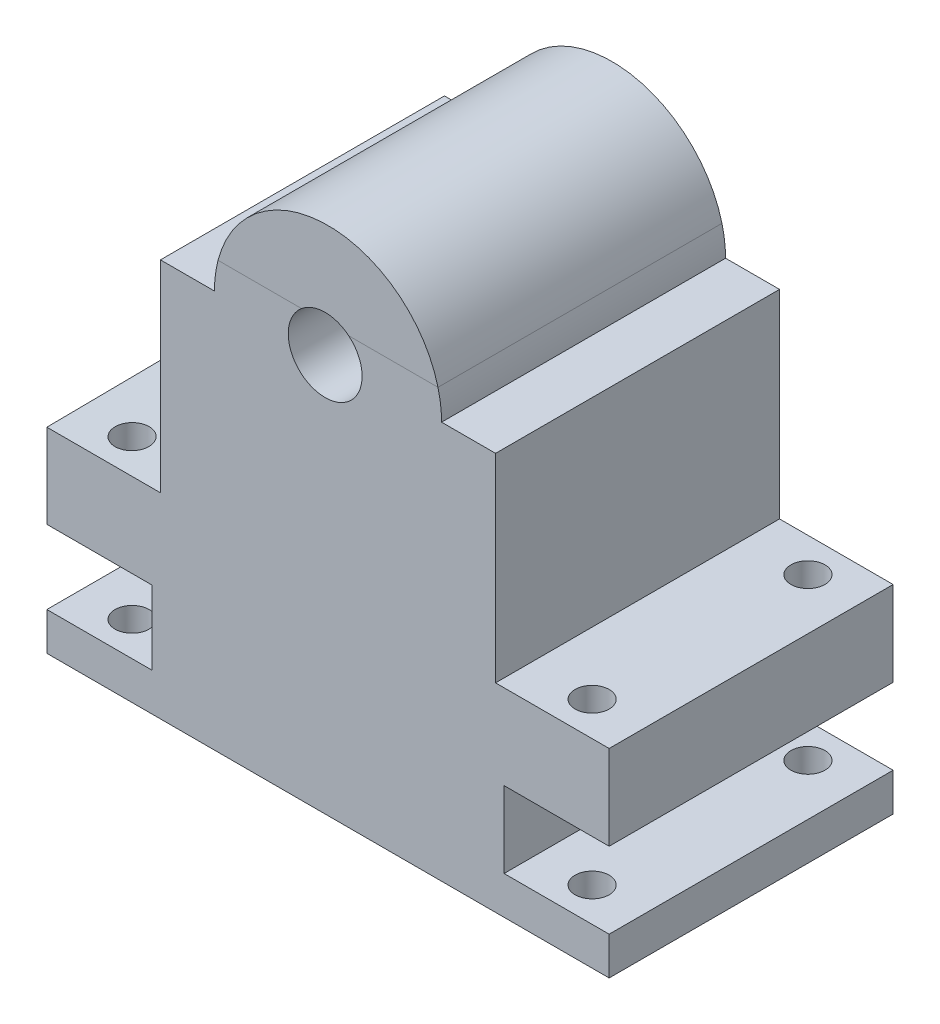
ISO-10303-21;
HEADER;
FILE_DESCRIPTION(('STEP AP214'),'2;1');
FILE_NAME('part.step','',(''),(''),'','','');
FILE_SCHEMA(('AUTOMOTIVE_DESIGN { 1 0 10303 214 1 1 1 1 }'));
ENDSEC;
DATA;
#1=APPLICATION_CONTEXT('core data for automotive mechanical design processes');
#2=APPLICATION_PROTOCOL_DEFINITION('international standard','automotive_design',2000,#1);
#3=PRODUCT_CONTEXT('',#1,'mechanical');
#4=PRODUCT('Part','Part','',(#3));
#5=PRODUCT_RELATED_PRODUCT_CATEGORY('part','',(#4));
#6=PRODUCT_DEFINITION_FORMATION('','',#4);
#7=PRODUCT_DEFINITION_CONTEXT('part definition',#1,'design');
#8=PRODUCT_DEFINITION('design','',#6,#7);
#9=PRODUCT_DEFINITION_SHAPE('','',#8);
#10=(LENGTH_UNIT() NAMED_UNIT(*) SI_UNIT(.MILLI.,.METRE.));
#11=(NAMED_UNIT(*) PLANE_ANGLE_UNIT() SI_UNIT($,.RADIAN.));
#12=(NAMED_UNIT(*) SI_UNIT($,.STERADIAN.) SOLID_ANGLE_UNIT());
#13=UNCERTAINTY_MEASURE_WITH_UNIT(LENGTH_MEASURE(1.E-05),#10,'distance_accuracy_value','');
#14=(GEOMETRIC_REPRESENTATION_CONTEXT(3) GLOBAL_UNCERTAINTY_ASSIGNED_CONTEXT((#13)) GLOBAL_UNIT_ASSIGNED_CONTEXT((#10,
#11,#12)) REPRESENTATION_CONTEXT('',''));
#15=CARTESIAN_POINT('',(0.,0.,0.));
#16=DIRECTION('',(0.,0.,1.));
#17=DIRECTION('',(1.,0.,0.));
#18=AXIS2_PLACEMENT_3D('',#15,#16,#17);
#19=CARTESIAN_POINT('',(0.,500.,0.));
#20=DIRECTION('',(0.,-1.,0.));
#21=DIRECTION('',(0.,0.,-1.));
#22=AXIS2_PLACEMENT_3D('',#19,#20,#21);
#23=PLANE('',#22);
#24=DIRECTION('',(0.,0.,-1.));
#25=VECTOR('',#24,1.);
#26=CARTESIAN_POINT('',(448.466880685408,500.,500.));
#27=LINE('',#26,#25);
#28=CARTESIAN_POINT('',(448.466880685408,500.,500.));
#29=VERTEX_POINT('',#28);
#30=CARTESIAN_POINT('',(448.466880685408,500.,0.));
#31=VERTEX_POINT('',#30);
#32=EDGE_CURVE('E59',#29,#31,#27,.T.);
#33=ORIENTED_EDGE('',*,*,#32,.F.);
#34=DIRECTION('',(1.,0.,0.));
#35=VECTOR('',#34,1.);
#36=CARTESIAN_POINT('',(495.,500.,500.));
#37=LINE('',#36,#35);
#38=CARTESIAN_POINT('',(301.350832689629,500.,500.));
#39=VERTEX_POINT('',#38);
#40=EDGE_CURVE('E93',#39,#29,#37,.T.);
#41=ORIENTED_EDGE('',*,*,#40,.F.);
#42=DIRECTION('',(0.,0.,-1.));
#43=VECTOR('',#42,1.);
#44=CARTESIAN_POINT('',(301.350832689629,500.,500.));
#45=LINE('',#44,#43);
#46=CARTESIAN_POINT('',(301.350832689629,500.,0.));
#47=VERTEX_POINT('',#46);
#48=EDGE_CURVE('E101',#39,#47,#45,.T.);
#49=ORIENTED_EDGE('',*,*,#48,.T.);
#50=DIRECTION('',(1.,0.,0.));
#51=VECTOR('',#50,1.);
#52=CARTESIAN_POINT('',(495.,500.,0.));
#53=LINE('',#52,#51);
#54=EDGE_CURVE('E96',#47,#31,#53,.T.);
#55=ORIENTED_EDGE('',*,*,#54,.T.);
#56=EDGE_LOOP('',(#33,#41,#49,#55));
#57=FACE_BOUND('',#56,.T.);
#58=ADVANCED_FACE('F44',(#57),#23,.T.);
#59=DIRECTION('',(0.,0.,-1.));
#60=VECTOR('',#59,1.);
#61=CARTESIAN_POINT('',(531.533119314591,500.,500.));
#62=LINE('',#61,#60);
#63=CARTESIAN_POINT('',(531.533119314591,500.,0.));
#64=VERTEX_POINT('',#63);
#65=CARTESIAN_POINT('',(531.533119314591,500.,500.));
#66=VERTEX_POINT('',#65);
#67=EDGE_CURVE('E86',#64,#66,#62,.F.);
#68=ORIENTED_EDGE('',*,*,#67,.F.);
#69=CARTESIAN_POINT('',(688.649167310371,500.,0.));
#70=VERTEX_POINT('',#69);
#71=EDGE_CURVE('E97',#64,#70,#53,.T.);
#72=ORIENTED_EDGE('',*,*,#71,.T.);
#73=DIRECTION('',(0.,0.,-1.));
#74=VECTOR('',#73,1.);
#75=CARTESIAN_POINT('',(688.649167310371,500.,500.));
#76=LINE('',#75,#74);
#77=CARTESIAN_POINT('',(688.649167310371,500.,500.));
#78=VERTEX_POINT('',#77);
#79=EDGE_CURVE('E105',#70,#78,#76,.F.);
#80=ORIENTED_EDGE('',*,*,#79,.T.);
#81=EDGE_CURVE('E67',#66,#78,#37,.T.);
#82=ORIENTED_EDGE('',*,*,#81,.F.);
#83=EDGE_LOOP('',(#68,#72,#80,#82));
#84=FACE_BOUND('',#83,.T.);
#85=ADVANCED_FACE('F110',(#84),#23,.T.);
#86=CARTESIAN_POINT('',(495.,450.,500.));
#87=DIRECTION('',(0.,0.,-1.));
#88=DIRECTION('',(-1.,0.,0.));
#89=AXIS2_PLACEMENT_3D('',#86,#87,#88);
#90=CYLINDRICAL_SURFACE('',#89,200.);
#91=ORIENTED_EDGE('',*,*,#48,.F.);
#92=CARTESIAN_POINT('',(495.,450.,500.));
#93=DIRECTION('',(0.,0.,1.));
#94=DIRECTION('',(1.,0.,0.));
#95=AXIS2_PLACEMENT_3D('',#92,#93,#94);
#96=CIRCLE('',#95,200.);
#97=EDGE_CURVE('E52',#78,#39,#96,.T.);
#98=ORIENTED_EDGE('',*,*,#97,.F.);
#99=ORIENTED_EDGE('',*,*,#79,.F.);
#100=CARTESIAN_POINT('',(495.,450.,0.));
#101=DIRECTION('',(0.,0.,1.));
#102=DIRECTION('',(1.,0.,0.));
#103=AXIS2_PLACEMENT_3D('',#100,#101,#102);
#104=CIRCLE('',#103,200.);
#105=EDGE_CURVE('E13',#70,#47,#104,.T.);
#106=ORIENTED_EDGE('',*,*,#105,.T.);
#107=EDGE_LOOP('',(#91,#98,#99,#106));
#108=FACE_BOUND('',#107,.T.);
#109=ADVANCED_FACE('F115',(#108),#90,.T.);
#110=CARTESIAN_POINT('',(495.,450.,500.));
#111=DIRECTION('',(0.,0.,1.));
#112=DIRECTION('',(1.,0.,0.));
#113=AXIS2_PLACEMENT_3D('',#110,#111,#112);
#114=PLANE('',#113);
#115=CARTESIAN_POINT('',(489.999999999999,450.000000000001,500.));
#116=DIRECTION('',(0.,0.,-1.));
#117=DIRECTION('',(-1.,0.,0.));
#118=AXIS2_PLACEMENT_3D('',#115,#116,#117);
#119=CIRCLE('',#118,65.);
#120=EDGE_CURVE('E83',#29,#66,#119,.T.);
#121=ORIENTED_EDGE('',*,*,#120,.T.);
#122=ORIENTED_EDGE('',*,*,#81,.T.);
#123=ORIENTED_EDGE('',*,*,#97,.T.);
#124=ORIENTED_EDGE('',*,*,#40,.T.);
#125=EDGE_LOOP('',(#121,#122,#123,#124));
#126=FACE_BOUND('',#125,.T.);
#127=ADVANCED_FACE('F46',(#126),#114,.T.);
#128=CARTESIAN_POINT('',(495.,450.,0.));
#129=DIRECTION('',(0.,0.,1.));
#130=DIRECTION('',(1.,0.,0.));
#131=AXIS2_PLACEMENT_3D('',#128,#129,#130);
#132=PLANE('',#131);
#133=ORIENTED_EDGE('',*,*,#71,.F.);
#134=CARTESIAN_POINT('',(489.999999999999,450.000000000001,0.));
#135=DIRECTION('',(0.,0.,-1.));
#136=DIRECTION('',(-1.,0.,0.));
#137=AXIS2_PLACEMENT_3D('',#134,#135,#136);
#138=CIRCLE('',#137,65.);
#139=EDGE_CURVE('E88',#31,#64,#138,.T.);
#140=ORIENTED_EDGE('',*,*,#139,.F.);
#141=ORIENTED_EDGE('',*,*,#54,.F.);
#142=ORIENTED_EDGE('',*,*,#105,.F.);
#143=EDGE_LOOP('',(#133,#140,#141,#142));
#144=FACE_BOUND('',#143,.T.);
#145=ADVANCED_FACE('F113',(#144),#132,.F.);
#146=CARTESIAN_POINT('',(489.999999999999,450.000000000001,500.));
#147=DIRECTION('',(0.,0.,-1.));
#148=DIRECTION('',(-1.,0.,0.));
#149=AXIS2_PLACEMENT_3D('',#146,#147,#148);
#150=CYLINDRICAL_SURFACE('',#149,65.);
#151=ORIENTED_EDGE('',*,*,#32,.T.);
#152=ORIENTED_EDGE('',*,*,#139,.T.);
#153=ORIENTED_EDGE('',*,*,#67,.T.);
#154=ORIENTED_EDGE('',*,*,#120,.F.);
#155=EDGE_LOOP('',(#151,#152,#153,#154));
#156=FACE_BOUND('',#155,.T.);
#157=ADVANCED_FACE('F84',(#156),#150,.F.);
#158=CLOSED_SHELL('',(#58,#85,#109,#127,#145,#157));
#159=MANIFOLD_SOLID_BREP('B2',#158);
#160=CARTESIAN_POINT('',(0.,500.,0.));
#161=DIRECTION('',(0.,-1.,0.));
#162=DIRECTION('',(0.,0.,-1.));
#163=AXIS2_PLACEMENT_3D('',#160,#161,#162);
#164=PLANE('',#163);
#165=DIRECTION('',(1.,0.,0.));
#166=VECTOR('',#165,1.);
#167=CARTESIAN_POINT('',(495.,500.,500.));
#168=LINE('',#167,#166);
#169=CARTESIAN_POINT('',(301.350832689629,500.,500.));
#170=VERTEX_POINT('',#169);
#171=CARTESIAN_POINT('',(448.466880685408,500.,500.));
#172=VERTEX_POINT('',#171);
#173=EDGE_CURVE('E179',#170,#172,#168,.T.);
#174=ORIENTED_EDGE('',*,*,#173,.T.);
#175=DIRECTION('',(0.,0.,-1.));
#176=VECTOR('',#175,1.);
#177=CARTESIAN_POINT('',(448.466880685408,500.,500.));
#178=LINE('',#177,#176);
#179=CARTESIAN_POINT('',(448.466880685408,500.,0.));
#180=VERTEX_POINT('',#179);
#181=EDGE_CURVE('E185',#172,#180,#178,.T.);
#182=ORIENTED_EDGE('',*,*,#181,.T.);
#183=DIRECTION('',(1.,0.,0.));
#184=VECTOR('',#183,1.);
#185=CARTESIAN_POINT('',(495.,500.,0.));
#186=LINE('',#185,#184);
#187=CARTESIAN_POINT('',(301.350832689629,500.,0.));
#188=VERTEX_POINT('',#187);
#189=EDGE_CURVE('E506',#188,#180,#186,.T.);
#190=ORIENTED_EDGE('',*,*,#189,.F.);
#191=DIRECTION('',(0.,0.,-1.));
#192=VECTOR('',#191,1.);
#193=CARTESIAN_POINT('',(301.350832689629,500.,500.));
#194=LINE('',#193,#192);
#195=EDGE_CURVE('E337',#170,#188,#194,.T.);
#196=ORIENTED_EDGE('',*,*,#195,.F.);
#197=EDGE_LOOP('',(#174,#182,#190,#196));
#198=FACE_BOUND('',#197,.T.);
#199=ADVANCED_FACE('F171',(#198),#164,.F.);
#200=CARTESIAN_POINT('',(0.,0.,500.));
#201=DIRECTION('',(1.,0.,0.));
#202=DIRECTION('',(0.,0.,-1.));
#203=AXIS2_PLACEMENT_3D('',#200,#201,#202);
#204=PLANE('',#203);
#205=DIRECTION('',(0.,-1.,0.));
#206=VECTOR('',#205,1.);
#207=CARTESIAN_POINT('',(0.,0.,500.));
#208=LINE('',#207,#206);
#209=CARTESIAN_POINT('',(0.,-183.114057522587,500.));
#210=VERTEX_POINT('',#209);
#211=CARTESIAN_POINT('',(0.,-250.,500.));
#212=VERTEX_POINT('',#211);
#213=EDGE_CURVE('E473',#210,#212,#208,.T.);
#214=ORIENTED_EDGE('',*,*,#213,.F.);
#215=DIRECTION('',(0.,0.,1.));
#216=VECTOR('',#215,1.);
#217=CARTESIAN_POINT('',(0.,-183.114057522587,500.));
#218=LINE('',#217,#216);
#219=CARTESIAN_POINT('',(0.,-183.114057522587,0.));
#220=VERTEX_POINT('',#219);
#221=EDGE_CURVE('E380',#220,#210,#218,.T.);
#222=ORIENTED_EDGE('',*,*,#221,.F.);
#223=DIRECTION('',(0.,-1.,0.));
#224=VECTOR('',#223,1.);
#225=CARTESIAN_POINT('',(0.,0.,0.));
#226=LINE('',#225,#224);
#227=CARTESIAN_POINT('',(0.,-250.,0.));
#228=VERTEX_POINT('',#227);
#229=EDGE_CURVE('E468',#220,#228,#226,.T.);
#230=ORIENTED_EDGE('',*,*,#229,.T.);
#231=DIRECTION('',(0.,0.,-1.));
#232=VECTOR('',#231,1.);
#233=CARTESIAN_POINT('',(0.,-250.,0.));
#234=LINE('',#233,#232);
#235=EDGE_CURVE('E459',#212,#228,#234,.T.);
#236=ORIENTED_EDGE('',*,*,#235,.F.);
#237=EDGE_LOOP('',(#214,#222,#230,#236));
#238=FACE_BOUND('',#237,.T.);
#239=ADVANCED_FACE('F566',(#238),#204,.F.);
#240=CARTESIAN_POINT('',(990.,0.,500.));
#241=DIRECTION('',(-1.,0.,0.));
#242=DIRECTION('',(0.,0.,1.));
#243=AXIS2_PLACEMENT_3D('',#240,#241,#242);
#244=PLANE('',#243);
#245=DIRECTION('',(0.,1.,0.));
#246=VECTOR('',#245,1.);
#247=CARTESIAN_POINT('',(990.,0.,500.));
#248=LINE('',#247,#246);
#249=CARTESIAN_POINT('',(990.,-49.1290615094595,500.));
#250=VERTEX_POINT('',#249);
#251=CARTESIAN_POINT('',(990.,100.,500.));
#252=VERTEX_POINT('',#251);
#253=EDGE_CURVE('E472',#250,#252,#248,.T.);
#254=ORIENTED_EDGE('',*,*,#253,.F.);
#255=DIRECTION('',(0.,0.,1.));
#256=VECTOR('',#255,1.);
#257=CARTESIAN_POINT('',(990.,-49.1290615094595,0.));
#258=LINE('',#257,#256);
#259=CARTESIAN_POINT('',(990.,-49.1290615094595,0.));
#260=VERTEX_POINT('',#259);
#261=EDGE_CURVE('E403',#260,#250,#258,.T.);
#262=ORIENTED_EDGE('',*,*,#261,.F.);
#263=DIRECTION('',(0.,1.,0.));
#264=VECTOR('',#263,1.);
#265=CARTESIAN_POINT('',(990.,0.,0.));
#266=LINE('',#265,#264);
#267=CARTESIAN_POINT('',(990.,100.,0.));
#268=VERTEX_POINT('',#267);
#269=EDGE_CURVE('E488',#260,#268,#266,.T.);
#270=ORIENTED_EDGE('',*,*,#269,.T.);
#271=DIRECTION('',(0.,0.,-1.));
#272=VECTOR('',#271,1.);
#273=CARTESIAN_POINT('',(990.,100.,500.));
#274=LINE('',#273,#272);
#275=EDGE_CURVE('E416',#252,#268,#274,.T.);
#276=ORIENTED_EDGE('',*,*,#275,.F.);
#277=EDGE_LOOP('',(#254,#262,#270,#276));
#278=FACE_BOUND('',#277,.T.);
#279=ADVANCED_FACE('F571',(#278),#244,.F.);
#280=CARTESIAN_POINT('',(990.,450.,500.));
#281=DIRECTION('',(0.,-1.,0.));
#282=DIRECTION('',(1.,0.,0.));
#283=AXIS2_PLACEMENT_3D('',#280,#281,#282);
#284=PLANE('',#283);
#285=DIRECTION('',(0.,0.,1.));
#286=VECTOR('',#285,1.);
#287=CARTESIAN_POINT('',(790.,450.,0.));
#288=LINE('',#287,#286);
#289=CARTESIAN_POINT('',(790.,450.,0.));
#290=VERTEX_POINT('',#289);
#291=CARTESIAN_POINT('',(790.,450.,500.));
#292=VERTEX_POINT('',#291);
#293=EDGE_CURVE('E431',#290,#292,#288,.T.);
#294=ORIENTED_EDGE('',*,*,#293,.F.);
#295=DIRECTION('',(-1.,0.,0.));
#296=VECTOR('',#295,1.);
#297=CARTESIAN_POINT('',(990.,450.,0.));
#298=LINE('',#297,#296);
#299=CARTESIAN_POINT('',(695.,450.,0.));
#300=VERTEX_POINT('',#299);
#301=EDGE_CURVE('E492',#290,#300,#298,.T.);
#302=ORIENTED_EDGE('',*,*,#301,.T.);
#303=DIRECTION('',(0.,0.,-1.));
#304=VECTOR('',#303,1.);
#305=CARTESIAN_POINT('',(695.,450.,500.));
#306=LINE('',#305,#304);
#307=CARTESIAN_POINT('',(695.,450.,500.));
#308=VERTEX_POINT('',#307);
#309=EDGE_CURVE('E503',#308,#300,#306,.T.);
#310=ORIENTED_EDGE('',*,*,#309,.F.);
#311=DIRECTION('',(-1.,0.,0.));
#312=VECTOR('',#311,1.);
#313=CARTESIAN_POINT('',(990.,450.,500.));
#314=LINE('',#313,#312);
#315=EDGE_CURVE('E477',#292,#308,#314,.T.);
#316=ORIENTED_EDGE('',*,*,#315,.F.);
#317=EDGE_LOOP('',(#294,#302,#310,#316));
#318=FACE_BOUND('',#317,.T.);
#319=ADVANCED_FACE('F582',(#318),#284,.F.);
#320=CARTESIAN_POINT('',(0.,450.,500.));
#321=DIRECTION('',(0.,-1.,0.));
#322=DIRECTION('',(1.,0.,0.));
#323=AXIS2_PLACEMENT_3D('',#320,#321,#322);
#324=PLANE('',#323);
#325=DIRECTION('',(0.,0.,-1.));
#326=VECTOR('',#325,1.);
#327=CARTESIAN_POINT('',(200.,450.,0.));
#328=LINE('',#327,#326);
#329=CARTESIAN_POINT('',(200.,450.,500.));
#330=VERTEX_POINT('',#329);
#331=CARTESIAN_POINT('',(200.,450.,0.));
#332=VERTEX_POINT('',#331);
#333=EDGE_CURVE('E444',#330,#332,#328,.T.);
#334=ORIENTED_EDGE('',*,*,#333,.F.);
#335=DIRECTION('',(-1.,0.,0.));
#336=VECTOR('',#335,1.);
#337=CARTESIAN_POINT('',(0.,450.,500.));
#338=LINE('',#337,#336);
#339=CARTESIAN_POINT('',(295.,450.,500.));
#340=VERTEX_POINT('',#339);
#341=EDGE_CURVE('E481',#340,#330,#338,.T.);
#342=ORIENTED_EDGE('',*,*,#341,.F.);
#343=DIRECTION('',(0.,0.,-1.));
#344=VECTOR('',#343,1.);
#345=CARTESIAN_POINT('',(295.,450.,500.));
#346=LINE('',#345,#344);
#347=CARTESIAN_POINT('',(295.,450.,0.));
#348=VERTEX_POINT('',#347);
#349=EDGE_CURVE('E484',#340,#348,#346,.T.);
#350=ORIENTED_EDGE('',*,*,#349,.T.);
#351=DIRECTION('',(-1.,0.,0.));
#352=VECTOR('',#351,1.);
#353=CARTESIAN_POINT('',(0.,450.,0.));
#354=LINE('',#353,#352);
#355=EDGE_CURVE('E498',#348,#332,#354,.T.);
#356=ORIENTED_EDGE('',*,*,#355,.T.);
#357=EDGE_LOOP('',(#334,#342,#350,#356));
#358=FACE_BOUND('',#357,.T.);
#359=ADVANCED_FACE('F575',(#358),#324,.F.);
#360=CARTESIAN_POINT('',(531.533119314591,500.,0.));
#361=VERTEX_POINT('',#360);
#362=CARTESIAN_POINT('',(688.649167310371,500.,0.));
#363=VERTEX_POINT('',#362);
#364=EDGE_CURVE('E330',#361,#363,#186,.T.);
#365=ORIENTED_EDGE('',*,*,#364,.F.);
#366=DIRECTION('',(0.,0.,-1.));
#367=VECTOR('',#366,1.);
#368=CARTESIAN_POINT('',(531.533119314591,500.,500.));
#369=LINE('',#368,#367);
#370=CARTESIAN_POINT('',(531.533119314591,500.,500.));
#371=VERTEX_POINT('',#370);
#372=EDGE_CURVE('E319',#361,#371,#369,.F.);
#373=ORIENTED_EDGE('',*,*,#372,.T.);
#374=CARTESIAN_POINT('',(688.649167310371,500.,500.));
#375=VERTEX_POINT('',#374);
#376=EDGE_CURVE('E328',#371,#375,#168,.T.);
#377=ORIENTED_EDGE('',*,*,#376,.T.);
#378=DIRECTION('',(0.,0.,-1.));
#379=VECTOR('',#378,1.);
#380=CARTESIAN_POINT('',(688.649167310371,500.,500.));
#381=LINE('',#380,#379);
#382=EDGE_CURVE('E339',#363,#375,#381,.F.);
#383=ORIENTED_EDGE('',*,*,#382,.F.);
#384=EDGE_LOOP('',(#365,#373,#377,#383));
#385=FACE_BOUND('',#384,.T.);
#386=ADVANCED_FACE('F173',(#385),#164,.F.);
#387=CARTESIAN_POINT('',(0.,100.,0.));
#388=VERTEX_POINT('',#387);
#389=CARTESIAN_POINT('',(0.,-53.2899855422073,0.));
#390=VERTEX_POINT('',#389);
#391=EDGE_CURVE('E485',#388,#390,#226,.T.);
#392=ORIENTED_EDGE('',*,*,#391,.T.);
#393=DIRECTION('',(0.,0.,-1.));
#394=VECTOR('',#393,1.);
#395=CARTESIAN_POINT('',(0.,-53.2899855422073,500.));
#396=LINE('',#395,#394);
#397=CARTESIAN_POINT('',(0.,-53.2899855422073,500.));
#398=VERTEX_POINT('',#397);
#399=EDGE_CURVE('E376',#398,#390,#396,.T.);
#400=ORIENTED_EDGE('',*,*,#399,.F.);
#401=CARTESIAN_POINT('',(0.,94.8716495346993,500.));
#402=VERTEX_POINT('',#401);
#403=EDGE_CURVE('E469',#402,#398,#208,.T.);
#404=ORIENTED_EDGE('',*,*,#403,.F.);
#405=DIRECTION('',(0.,-0.0102561614711365,0.999947404192779));
#406=VECTOR('',#405,1.);
#407=CARTESIAN_POINT('',(0.,94.8716495346993,500.));
#408=LINE('',#407,#406);
#409=EDGE_CURVE('E439',#388,#402,#408,.T.);
#410=ORIENTED_EDGE('',*,*,#409,.F.);
#411=EDGE_LOOP('',(#392,#400,#404,#410));
#412=FACE_BOUND('',#411,.T.);
#413=ADVANCED_FACE('F573',(#412),#204,.F.);
#414=CARTESIAN_POINT('',(0.,-250.,0.));
#415=DIRECTION('',(0.,1.,0.));
#416=DIRECTION('',(0.,0.,1.));
#417=AXIS2_PLACEMENT_3D('',#414,#415,#416);
#418=PLANE('',#417);
#419=CARTESIAN_POINT('',(900.,-250.,60.));
#420=DIRECTION('',(0.,1.,0.));
#421=DIRECTION('',(0.,0.,1.));
#422=AXIS2_PLACEMENT_3D('',#419,#420,#421);
#423=CIRCLE('',#422,30.);
#424=CARTESIAN_POINT('',(900.,-250.,90.0000000000001));
#425=VERTEX_POINT('',#424);
#426=EDGE_CURVE('E364',#425,#425,#423,.T.);
#427=ORIENTED_EDGE('',*,*,#426,.T.);
#428=EDGE_LOOP('',(#427));
#429=FACE_BOUND('',#428,.T.);
#430=CARTESIAN_POINT('',(90.,-250.,440.));
#431=DIRECTION('',(0.,1.,0.));
#432=DIRECTION('',(0.,0.,1.));
#433=AXIS2_PLACEMENT_3D('',#430,#431,#432);
#434=CIRCLE('',#433,30.);
#435=CARTESIAN_POINT('',(90.,-250.,470.));
#436=VERTEX_POINT('',#435);
#437=EDGE_CURVE('E356',#436,#436,#434,.T.);
#438=ORIENTED_EDGE('',*,*,#437,.T.);
#439=EDGE_LOOP('',(#438));
#440=FACE_BOUND('',#439,.T.);
#441=CARTESIAN_POINT('',(90.,-250.,60.));
#442=DIRECTION('',(0.,1.,0.));
#443=DIRECTION('',(0.,0.,1.));
#444=AXIS2_PLACEMENT_3D('',#441,#442,#443);
#445=CIRCLE('',#444,30.);
#446=CARTESIAN_POINT('',(90.,-250.,90.));
#447=VERTEX_POINT('',#446);
#448=EDGE_CURVE('E352',#447,#447,#445,.T.);
#449=ORIENTED_EDGE('',*,*,#448,.T.);
#450=EDGE_LOOP('',(#449));
#451=FACE_BOUND('',#450,.T.);
#452=CARTESIAN_POINT('',(900.,-250.,440.));
#453=DIRECTION('',(0.,1.,0.));
#454=DIRECTION('',(0.,0.,1.));
#455=AXIS2_PLACEMENT_3D('',#452,#453,#454);
#456=CIRCLE('',#455,30.0000000000001);
#457=CARTESIAN_POINT('',(900.,-250.,470.));
#458=VERTEX_POINT('',#457);
#459=EDGE_CURVE('E360',#458,#458,#456,.T.);
#460=ORIENTED_EDGE('',*,*,#459,.T.);
#461=EDGE_LOOP('',(#460));
#462=FACE_BOUND('',#461,.T.);
#463=DIRECTION('',(-1.,0.,0.));
#464=VECTOR('',#463,1.);
#465=CARTESIAN_POINT('',(0.,-250.,500.));
#466=LINE('',#465,#464);
#467=CARTESIAN_POINT('',(990.,-250.,500.));
#468=VERTEX_POINT('',#467);
#469=EDGE_CURVE('E455',#468,#212,#466,.T.);
#470=ORIENTED_EDGE('',*,*,#469,.T.);
#471=ORIENTED_EDGE('',*,*,#235,.T.);
#472=DIRECTION('',(1.,0.,0.));
#473=VECTOR('',#472,1.);
#474=CARTESIAN_POINT('',(990.,-250.,0.));
#475=LINE('',#474,#473);
#476=CARTESIAN_POINT('',(990.,-250.,0.));
#477=VERTEX_POINT('',#476);
#478=EDGE_CURVE('E462',#228,#477,#475,.T.);
#479=ORIENTED_EDGE('',*,*,#478,.T.);
#480=DIRECTION('',(0.,0.,1.));
#481=VECTOR('',#480,1.);
#482=CARTESIAN_POINT('',(990.,-250.,500.));
#483=LINE('',#482,#481);
#484=EDGE_CURVE('E465',#477,#468,#483,.T.);
#485=ORIENTED_EDGE('',*,*,#484,.T.);
#486=EDGE_LOOP('',(#470,#471,#479,#485));
#487=FACE_BOUND('',#486,.T.);
#488=ADVANCED_FACE('F540',(#429,#440,#451,#462,#487),#418,.F.);
#489=CARTESIAN_POINT('',(990.,-183.170375912482,0.));
#490=VERTEX_POINT('',#489);
#491=EDGE_CURVE('E489',#477,#490,#266,.T.);
#492=ORIENTED_EDGE('',*,*,#491,.T.);
#493=DIRECTION('',(0.,0.,-1.));
#494=VECTOR('',#493,1.);
#495=CARTESIAN_POINT('',(990.,-183.170375912482,500.));
#496=LINE('',#495,#494);
#497=CARTESIAN_POINT('',(990.,-183.170375912482,500.));
#498=VERTEX_POINT('',#497);
#499=EDGE_CURVE('E392',#498,#490,#496,.T.);
#500=ORIENTED_EDGE('',*,*,#499,.F.);
#501=EDGE_CURVE('E474',#468,#498,#248,.T.);
#502=ORIENTED_EDGE('',*,*,#501,.F.);
#503=ORIENTED_EDGE('',*,*,#484,.F.);
#504=EDGE_LOOP('',(#492,#500,#502,#503));
#505=FACE_BOUND('',#504,.T.);
#506=ADVANCED_FACE('F600',(#505),#244,.F.);
#507=CARTESIAN_POINT('',(495.,450.,500.));
#508=DIRECTION('',(0.,0.,-1.));
#509=DIRECTION('',(-1.,0.,0.));
#510=AXIS2_PLACEMENT_3D('',#507,#508,#509);
#511=CYLINDRICAL_SURFACE('',#510,200.);
#512=CARTESIAN_POINT('',(495.,450.,0.));
#513=DIRECTION('',(0.,0.,1.));
#514=DIRECTION('',(1.,0.,0.));
#515=AXIS2_PLACEMENT_3D('',#512,#513,#514);
#516=CIRCLE('',#515,200.);
#517=EDGE_CURVE('E495',#300,#363,#516,.T.);
#518=ORIENTED_EDGE('',*,*,#517,.T.);
#519=ORIENTED_EDGE('',*,*,#382,.T.);
#520=CARTESIAN_POINT('',(495.,450.,500.));
#521=DIRECTION('',(0.,0.,1.));
#522=DIRECTION('',(1.,0.,0.));
#523=AXIS2_PLACEMENT_3D('',#520,#521,#522);
#524=CIRCLE('',#523,200.);
#525=EDGE_CURVE('E336',#308,#375,#524,.T.);
#526=ORIENTED_EDGE('',*,*,#525,.F.);
#527=ORIENTED_EDGE('',*,*,#309,.T.);
#528=EDGE_LOOP('',(#518,#519,#526,#527));
#529=FACE_BOUND('',#528,.T.);
#530=ADVANCED_FACE('F509',(#529),#511,.T.);
#531=EDGE_CURVE('E479',#170,#340,#524,.T.);
#532=ORIENTED_EDGE('',*,*,#531,.F.);
#533=ORIENTED_EDGE('',*,*,#195,.T.);
#534=EDGE_CURVE('E494',#188,#348,#516,.T.);
#535=ORIENTED_EDGE('',*,*,#534,.T.);
#536=ORIENTED_EDGE('',*,*,#349,.F.);
#537=EDGE_LOOP('',(#532,#533,#535,#536));
#538=FACE_BOUND('',#537,.T.);
#539=ADVANCED_FACE('F594',(#538),#511,.T.);
#540=CARTESIAN_POINT('',(495.,450.,0.));
#541=DIRECTION('',(0.,0.,1.));
#542=DIRECTION('',(1.,0.,0.));
#543=AXIS2_PLACEMENT_3D('',#540,#541,#542);
#544=PLANE('',#543);
#545=ORIENTED_EDGE('',*,*,#189,.T.);
#546=CARTESIAN_POINT('',(489.999999999999,450.000000000001,0.));
#547=DIRECTION('',(0.,0.,-1.));
#548=DIRECTION('',(-1.,0.,0.));
#549=AXIS2_PLACEMENT_3D('',#546,#547,#548);
#550=CIRCLE('',#549,65.);
#551=EDGE_CURVE('E331',#361,#180,#550,.T.);
#552=ORIENTED_EDGE('',*,*,#551,.F.);
#553=ORIENTED_EDGE('',*,*,#364,.T.);
#554=ORIENTED_EDGE('',*,*,#517,.F.);
#555=ORIENTED_EDGE('',*,*,#301,.F.);
#556=DIRECTION('',(0.,1.,0.));
#557=VECTOR('',#556,1.);
#558=CARTESIAN_POINT('',(790.,100.,0.));
#559=LINE('',#558,#557);
#560=CARTESIAN_POINT('',(790.,100.,0.));
#561=VERTEX_POINT('',#560);
#562=EDGE_CURVE('E429',#561,#290,#559,.T.);
#563=ORIENTED_EDGE('',*,*,#562,.F.);
#564=DIRECTION('',(1.,0.,0.));
#565=VECTOR('',#564,1.);
#566=CARTESIAN_POINT('',(790.,100.,0.));
#567=LINE('',#566,#565);
#568=EDGE_CURVE('E436',#561,#268,#567,.T.);
#569=ORIENTED_EDGE('',*,*,#568,.T.);
#570=ORIENTED_EDGE('',*,*,#269,.F.);
#571=DIRECTION('',(1.,0.,0.));
#572=VECTOR('',#571,1.);
#573=CARTESIAN_POINT('',(805.,-49.1290615094595,0.));
#574=LINE('',#573,#572);
#575=CARTESIAN_POINT('',(805.,-49.1290615094595,0.));
#576=VERTEX_POINT('',#575);
#577=EDGE_CURVE('E417',#576,#260,#574,.T.);
#578=ORIENTED_EDGE('',*,*,#577,.F.);
#579=DIRECTION('',(0.,1.,0.));
#580=VECTOR('',#579,1.);
#581=CARTESIAN_POINT('',(805.,-183.170375912482,0.));
#582=LINE('',#581,#580);
#583=CARTESIAN_POINT('',(805.,-183.170375912482,0.));
#584=VERTEX_POINT('',#583);
#585=EDGE_CURVE('E406',#584,#576,#582,.T.);
#586=ORIENTED_EDGE('',*,*,#585,.F.);
#587=DIRECTION('',(1.,0.,0.));
#588=VECTOR('',#587,1.);
#589=CARTESIAN_POINT('',(805.,-183.170375912482,0.));
#590=LINE('',#589,#588);
#591=EDGE_CURVE('E419',#584,#490,#590,.T.);
#592=ORIENTED_EDGE('',*,*,#591,.T.);
#593=ORIENTED_EDGE('',*,*,#491,.F.);
#594=ORIENTED_EDGE('',*,*,#478,.F.);
#595=ORIENTED_EDGE('',*,*,#229,.F.);
#596=DIRECTION('',(-1.,0.,0.));
#597=VECTOR('',#596,1.);
#598=CARTESIAN_POINT('',(185.,-183.114057522587,0.));
#599=LINE('',#598,#597);
#600=CARTESIAN_POINT('',(185.,-183.114057522587,0.));
#601=VERTEX_POINT('',#600);
#602=EDGE_CURVE('E393',#601,#220,#599,.T.);
#603=ORIENTED_EDGE('',*,*,#602,.F.);
#604=DIRECTION('',(0.,-1.,0.));
#605=VECTOR('',#604,1.);
#606=CARTESIAN_POINT('',(185.,-183.114057522587,0.));
#607=LINE('',#606,#605);
#608=CARTESIAN_POINT('',(185.,-53.2899855422073,0.));
#609=VERTEX_POINT('',#608);
#610=EDGE_CURVE('E383',#609,#601,#607,.T.);
#611=ORIENTED_EDGE('',*,*,#610,.F.);
#612=DIRECTION('',(-1.,0.,0.));
#613=VECTOR('',#612,1.);
#614=CARTESIAN_POINT('',(185.,-53.2899855422073,0.));
#615=LINE('',#614,#613);
#616=EDGE_CURVE('E395',#609,#390,#615,.T.);
#617=ORIENTED_EDGE('',*,*,#616,.T.);
#618=ORIENTED_EDGE('',*,*,#391,.F.);
#619=DIRECTION('',(-1.,0.,0.));
#620=VECTOR('',#619,1.);
#621=CARTESIAN_POINT('',(200.,100.,0.));
#622=LINE('',#621,#620);
#623=CARTESIAN_POINT('',(200.,100.,0.));
#624=VERTEX_POINT('',#623);
#625=EDGE_CURVE('E450',#624,#388,#622,.T.);
#626=ORIENTED_EDGE('',*,*,#625,.F.);
#627=DIRECTION('',(0.,-1.,0.));
#628=VECTOR('',#627,1.);
#629=CARTESIAN_POINT('',(200.,100.,0.));
#630=LINE('',#629,#628);
#631=EDGE_CURVE('E446',#332,#624,#630,.T.);
#632=ORIENTED_EDGE('',*,*,#631,.F.);
#633=ORIENTED_EDGE('',*,*,#355,.F.);
#634=ORIENTED_EDGE('',*,*,#534,.F.);
#635=EDGE_LOOP('',(#545,#552,#553,#554,#555,#563,#569,#570,#578,#586,#592,#593,#594,#595,#603,
#611,#617,#618,#626,#632,#633,#634));
#636=FACE_BOUND('',#635,.T.);
#637=ADVANCED_FACE('F514',(#636),#544,.F.);
#638=CARTESIAN_POINT('',(495.,450.,500.));
#639=DIRECTION('',(0.,0.,1.));
#640=DIRECTION('',(1.,0.,0.));
#641=AXIS2_PLACEMENT_3D('',#638,#639,#640);
#642=PLANE('',#641);
#643=CARTESIAN_POINT('',(489.999999999999,450.000000000001,500.));
#644=DIRECTION('',(0.,0.,1.));
#645=DIRECTION('',(1.,0.,0.));
#646=AXIS2_PLACEMENT_3D('',#643,#644,#645);
#647=CIRCLE('',#646,65.);
#648=EDGE_CURVE('E42',#172,#371,#647,.T.);
#649=ORIENTED_EDGE('',*,*,#648,.F.);
#650=ORIENTED_EDGE('',*,*,#173,.F.);
#651=ORIENTED_EDGE('',*,*,#531,.T.);
#652=ORIENTED_EDGE('',*,*,#341,.T.);
#653=DIRECTION('',(0.,1.,0.));
#654=VECTOR('',#653,1.);
#655=CARTESIAN_POINT('',(200.,450.,500.));
#656=LINE('',#655,#654);
#657=CARTESIAN_POINT('',(200.,94.8716495346993,500.));
#658=VERTEX_POINT('',#657);
#659=EDGE_CURVE('E442',#658,#330,#656,.T.);
#660=ORIENTED_EDGE('',*,*,#659,.F.);
#661=DIRECTION('',(-1.,0.,0.));
#662=VECTOR('',#661,1.);
#663=CARTESIAN_POINT('',(200.,94.8716495346993,500.));
#664=LINE('',#663,#662);
#665=EDGE_CURVE('E452',#658,#402,#664,.T.);
#666=ORIENTED_EDGE('',*,*,#665,.T.);
#667=ORIENTED_EDGE('',*,*,#403,.T.);
#668=DIRECTION('',(-1.,0.,0.));
#669=VECTOR('',#668,1.);
#670=CARTESIAN_POINT('',(185.,-53.2899855422073,500.));
#671=LINE('',#670,#669);
#672=CARTESIAN_POINT('',(185.,-53.2899855422073,500.));
#673=VERTEX_POINT('',#672);
#674=EDGE_CURVE('E386',#673,#398,#671,.T.);
#675=ORIENTED_EDGE('',*,*,#674,.F.);
#676=DIRECTION('',(0.,1.,0.));
#677=VECTOR('',#676,1.);
#678=CARTESIAN_POINT('',(185.,-53.2899855422073,500.));
#679=LINE('',#678,#677);
#680=CARTESIAN_POINT('',(185.,-183.114057522587,500.));
#681=VERTEX_POINT('',#680);
#682=EDGE_CURVE('E377',#681,#673,#679,.T.);
#683=ORIENTED_EDGE('',*,*,#682,.F.);
#684=DIRECTION('',(-1.,0.,0.));
#685=VECTOR('',#684,1.);
#686=CARTESIAN_POINT('',(185.,-183.114057522587,500.));
#687=LINE('',#686,#685);
#688=EDGE_CURVE('E389',#681,#210,#687,.T.);
#689=ORIENTED_EDGE('',*,*,#688,.T.);
#690=ORIENTED_EDGE('',*,*,#213,.T.);
#691=ORIENTED_EDGE('',*,*,#469,.F.);
#692=ORIENTED_EDGE('',*,*,#501,.T.);
#693=DIRECTION('',(1.,0.,0.));
#694=VECTOR('',#693,1.);
#695=CARTESIAN_POINT('',(805.,-183.170375912482,500.));
#696=LINE('',#695,#694);
#697=CARTESIAN_POINT('',(805.,-183.170375912482,500.));
#698=VERTEX_POINT('',#697);
#699=EDGE_CURVE('E410',#698,#498,#696,.T.);
#700=ORIENTED_EDGE('',*,*,#699,.F.);
#701=DIRECTION('',(0.,-1.,0.));
#702=VECTOR('',#701,1.);
#703=CARTESIAN_POINT('',(805.,-49.1290615094595,500.));
#704=LINE('',#703,#702);
#705=CARTESIAN_POINT('',(805.,-49.1290615094595,500.));
#706=VERTEX_POINT('',#705);
#707=EDGE_CURVE('E399',#706,#698,#704,.T.);
#708=ORIENTED_EDGE('',*,*,#707,.F.);
#709=DIRECTION('',(1.,0.,0.));
#710=VECTOR('',#709,1.);
#711=CARTESIAN_POINT('',(805.,-49.1290615094595,500.));
#712=LINE('',#711,#710);
#713=EDGE_CURVE('E413',#706,#250,#712,.T.);
#714=ORIENTED_EDGE('',*,*,#713,.T.);
#715=ORIENTED_EDGE('',*,*,#253,.T.);
#716=DIRECTION('',(1.,0.,0.));
#717=VECTOR('',#716,1.);
#718=CARTESIAN_POINT('',(790.,100.,500.));
#719=LINE('',#718,#717);
#720=CARTESIAN_POINT('',(790.,100.,500.));
#721=VERTEX_POINT('',#720);
#722=EDGE_CURVE('E433',#721,#252,#719,.T.);
#723=ORIENTED_EDGE('',*,*,#722,.F.);
#724=DIRECTION('',(0.,-1.,0.));
#725=VECTOR('',#724,1.);
#726=CARTESIAN_POINT('',(790.,450.,500.));
#727=LINE('',#726,#725);
#728=EDGE_CURVE('E423',#292,#721,#727,.T.);
#729=ORIENTED_EDGE('',*,*,#728,.F.);
#730=ORIENTED_EDGE('',*,*,#315,.T.);
#731=ORIENTED_EDGE('',*,*,#525,.T.);
#732=ORIENTED_EDGE('',*,*,#376,.F.);
#733=EDGE_LOOP('',(#649,#650,#651,#652,#660,#666,#667,#675,#683,#689,#690,#691,#692,#700,#708,
#714,#715,#723,#729,#730,#731,#732));
#734=FACE_BOUND('',#733,.T.);
#735=ADVANCED_FACE('F334',(#734),#642,.T.);
#736=CARTESIAN_POINT('',(200.,94.8716495346993,500.));
#737=DIRECTION('',(0.,-0.999947404192779,-0.0102561614711365));
#738=DIRECTION('',(0.,0.0102561614711365,-0.99994740419278));
#739=AXIS2_PLACEMENT_3D('',#736,#737,#738);
#740=PLANE('',#739);
#741=CARTESIAN_POINT('',(90.,95.4870515905354,440.));
#742=DIRECTION('',(0.,-0.999947404192779,-0.0102561614711365));
#743=DIRECTION('',(0.,0.0102561614711365,-0.99994740419278));
#744=AXIS2_PLACEMENT_3D('',#741,#742,#743);
#745=ELLIPSE('',#744,30.0015779572106,30.);
#746=CARTESIAN_POINT('',(90.,95.7947526184534,410.));
#747=VERTEX_POINT('',#746);
#748=EDGE_CURVE('E535',#747,#747,#745,.T.);
#749=ORIENTED_EDGE('',*,*,#748,.T.);
#750=EDGE_LOOP('',(#749));
#751=FACE_BOUND('',#750,.T.);
#752=CARTESIAN_POINT('',(90.,99.3845979441639,60.));
#753=DIRECTION('',(0.,-0.999947404192779,-0.0102561614711365));
#754=DIRECTION('',(0.,0.0102561614711365,-0.99994740419278));
#755=AXIS2_PLACEMENT_3D('',#752,#753,#754);
#756=ELLIPSE('',#755,30.0015779572106,30.);
#757=CARTESIAN_POINT('',(90.,99.6922989720819,30.));
#758=VERTEX_POINT('',#757);
#759=EDGE_CURVE('E528',#758,#758,#756,.T.);
#760=ORIENTED_EDGE('',*,*,#759,.T.);
#761=EDGE_LOOP('',(#760));
#762=FACE_BOUND('',#761,.T.);
#763=ORIENTED_EDGE('',*,*,#409,.T.);
#764=ORIENTED_EDGE('',*,*,#665,.F.);
#765=DIRECTION('',(0.,-0.0102561614711365,0.999947404192779));
#766=VECTOR('',#765,1.);
#767=CARTESIAN_POINT('',(200.,94.8716495346993,500.));
#768=LINE('',#767,#766);
#769=EDGE_CURVE('E448',#624,#658,#768,.T.);
#770=ORIENTED_EDGE('',*,*,#769,.F.);
#771=ORIENTED_EDGE('',*,*,#625,.T.);
#772=EDGE_LOOP('',(#763,#764,#770,#771));
#773=FACE_BOUND('',#772,.T.);
#774=ADVANCED_FACE('F581',(#751,#762,#773),#740,.F.);
#775=CARTESIAN_POINT('',(200.,0.,0.));
#776=DIRECTION('',(-1.,0.,0.));
#777=DIRECTION('',(0.,0.,1.));
#778=AXIS2_PLACEMENT_3D('',#775,#776,#777);
#779=PLANE('',#778);
#780=ORIENTED_EDGE('',*,*,#659,.T.);
#781=ORIENTED_EDGE('',*,*,#333,.T.);
#782=ORIENTED_EDGE('',*,*,#631,.T.);
#783=ORIENTED_EDGE('',*,*,#769,.T.);
#784=EDGE_LOOP('',(#780,#781,#782,#783));
#785=FACE_BOUND('',#784,.T.);
#786=ADVANCED_FACE('F591',(#785),#779,.T.);
#787=CARTESIAN_POINT('',(790.,100.,500.));
#788=DIRECTION('',(0.,-1.,0.));
#789=DIRECTION('',(0.,0.,-1.));
#790=AXIS2_PLACEMENT_3D('',#787,#788,#789);
#791=PLANE('',#790);
#792=CARTESIAN_POINT('',(900.,100.,60.));
#793=DIRECTION('',(0.,1.,0.));
#794=DIRECTION('',(0.,0.,1.));
#795=AXIS2_PLACEMENT_3D('',#792,#793,#794);
#796=CIRCLE('',#795,30.);
#797=CARTESIAN_POINT('',(900.,100.,90.0000000000001));
#798=VERTEX_POINT('',#797);
#799=EDGE_CURVE('E521',#798,#798,#796,.T.);
#800=ORIENTED_EDGE('',*,*,#799,.F.);
#801=EDGE_LOOP('',(#800));
#802=FACE_BOUND('',#801,.T.);
#803=CARTESIAN_POINT('',(900.,100.,440.));
#804=DIRECTION('',(0.,1.,0.));
#805=DIRECTION('',(0.,0.,1.));
#806=AXIS2_PLACEMENT_3D('',#803,#804,#805);
#807=CIRCLE('',#806,30.0000000000001);
#808=CARTESIAN_POINT('',(900.,100.,470.));
#809=VERTEX_POINT('',#808);
#810=EDGE_CURVE('E347',#809,#809,#807,.T.);
#811=ORIENTED_EDGE('',*,*,#810,.F.);
#812=EDGE_LOOP('',(#811));
#813=FACE_BOUND('',#812,.T.);
#814=ORIENTED_EDGE('',*,*,#275,.T.);
#815=ORIENTED_EDGE('',*,*,#568,.F.);
#816=DIRECTION('',(0.,0.,-1.));
#817=VECTOR('',#816,1.);
#818=CARTESIAN_POINT('',(790.,100.,500.));
#819=LINE('',#818,#817);
#820=EDGE_CURVE('E426',#721,#561,#819,.T.);
#821=ORIENTED_EDGE('',*,*,#820,.F.);
#822=ORIENTED_EDGE('',*,*,#722,.T.);
#823=EDGE_LOOP('',(#814,#815,#821,#822));
#824=FACE_BOUND('',#823,.T.);
#825=ADVANCED_FACE('F623',(#802,#813,#824),#791,.F.);
#826=CARTESIAN_POINT('',(790.,0.,0.));
#827=DIRECTION('',(1.,0.,0.));
#828=DIRECTION('',(0.,0.,-1.));
#829=AXIS2_PLACEMENT_3D('',#826,#827,#828);
#830=PLANE('',#829);
#831=ORIENTED_EDGE('',*,*,#728,.T.);
#832=ORIENTED_EDGE('',*,*,#820,.T.);
#833=ORIENTED_EDGE('',*,*,#562,.T.);
#834=ORIENTED_EDGE('',*,*,#293,.T.);
#835=EDGE_LOOP('',(#831,#832,#833,#834));
#836=FACE_BOUND('',#835,.T.);
#837=ADVANCED_FACE('F625',(#836),#830,.T.);
#838=CARTESIAN_POINT('',(805.,-49.1290615094595,0.));
#839=DIRECTION('',(0.,1.,0.));
#840=DIRECTION('',(0.,0.,1.));
#841=AXIS2_PLACEMENT_3D('',#838,#839,#840);
#842=PLANE('',#841);
#843=CARTESIAN_POINT('',(900.,-49.1290615094595,60.));
#844=DIRECTION('',(0.,1.,0.));
#845=DIRECTION('',(0.,0.,1.));
#846=AXIS2_PLACEMENT_3D('',#843,#844,#845);
#847=CIRCLE('',#846,30.);
#848=CARTESIAN_POINT('',(900.,-49.1290615094595,90.0000000000001));
#849=VERTEX_POINT('',#848);
#850=EDGE_CURVE('E359',#849,#849,#847,.T.);
#851=ORIENTED_EDGE('',*,*,#850,.T.);
#852=EDGE_LOOP('',(#851));
#853=FACE_BOUND('',#852,.T.);
#854=CARTESIAN_POINT('',(900.,-49.1290615094595,440.));
#855=DIRECTION('',(0.,1.,0.));
#856=DIRECTION('',(0.,0.,1.));
#857=AXIS2_PLACEMENT_3D('',#854,#855,#856);
#858=CIRCLE('',#857,30.0000000000001);
#859=CARTESIAN_POINT('',(900.,-49.1290615094595,470.));
#860=VERTEX_POINT('',#859);
#861=EDGE_CURVE('E355',#860,#860,#858,.T.);
#862=ORIENTED_EDGE('',*,*,#861,.T.);
#863=EDGE_LOOP('',(#862));
#864=FACE_BOUND('',#863,.T.);
#865=ORIENTED_EDGE('',*,*,#261,.T.);
#866=ORIENTED_EDGE('',*,*,#713,.F.);
#867=DIRECTION('',(0.,0.,1.));
#868=VECTOR('',#867,1.);
#869=CARTESIAN_POINT('',(805.,-49.1290615094595,0.));
#870=LINE('',#869,#868);
#871=EDGE_CURVE('E408',#576,#706,#870,.T.);
#872=ORIENTED_EDGE('',*,*,#871,.F.);
#873=ORIENTED_EDGE('',*,*,#577,.T.);
#874=EDGE_LOOP('',(#865,#866,#872,#873));
#875=FACE_BOUND('',#874,.T.);
#876=ADVANCED_FACE('F632',(#853,#864,#875),#842,.F.);
#877=CARTESIAN_POINT('',(805.,-183.170375912482,500.));
#878=DIRECTION('',(0.,-1.,0.));
#879=DIRECTION('',(0.,0.,-1.));
#880=AXIS2_PLACEMENT_3D('',#877,#878,#879);
#881=PLANE('',#880);
#882=CARTESIAN_POINT('',(900.,-183.170375912482,60.));
#883=DIRECTION('',(0.,-1.,0.));
#884=DIRECTION('',(0.,0.,-1.));
#885=AXIS2_PLACEMENT_3D('',#882,#883,#884);
#886=CIRCLE('',#885,30.);
#887=CARTESIAN_POINT('',(900.,-183.170375912482,29.9999999999999));
#888=VERTEX_POINT('',#887);
#889=EDGE_CURVE('E357',#888,#888,#886,.T.);
#890=ORIENTED_EDGE('',*,*,#889,.T.);
#891=EDGE_LOOP('',(#890));
#892=FACE_BOUND('',#891,.T.);
#893=CARTESIAN_POINT('',(900.,-183.170375912482,440.));
#894=DIRECTION('',(0.,-1.,0.));
#895=DIRECTION('',(0.,0.,-1.));
#896=AXIS2_PLACEMENT_3D('',#893,#894,#895);
#897=CIRCLE('',#896,30.0000000000001);
#898=CARTESIAN_POINT('',(900.,-183.170375912482,410.));
#899=VERTEX_POINT('',#898);
#900=EDGE_CURVE('E353',#899,#899,#897,.T.);
#901=ORIENTED_EDGE('',*,*,#900,.T.);
#902=EDGE_LOOP('',(#901));
#903=FACE_BOUND('',#902,.T.);
#904=ORIENTED_EDGE('',*,*,#499,.T.);
#905=ORIENTED_EDGE('',*,*,#591,.F.);
#906=DIRECTION('',(0.,0.,-1.));
#907=VECTOR('',#906,1.);
#908=CARTESIAN_POINT('',(805.,-183.170375912482,500.));
#909=LINE('',#908,#907);
#910=EDGE_CURVE('E402',#698,#584,#909,.T.);
#911=ORIENTED_EDGE('',*,*,#910,.F.);
#912=ORIENTED_EDGE('',*,*,#699,.T.);
#913=EDGE_LOOP('',(#904,#905,#911,#912));
#914=FACE_BOUND('',#913,.T.);
#915=ADVANCED_FACE('F637',(#892,#903,#914),#881,.F.);
#916=CARTESIAN_POINT('',(805.,0.,0.));
#917=DIRECTION('',(1.,0.,0.));
#918=DIRECTION('',(0.,0.,-1.));
#919=AXIS2_PLACEMENT_3D('',#916,#917,#918);
#920=PLANE('',#919);
#921=ORIENTED_EDGE('',*,*,#707,.T.);
#922=ORIENTED_EDGE('',*,*,#910,.T.);
#923=ORIENTED_EDGE('',*,*,#585,.T.);
#924=ORIENTED_EDGE('',*,*,#871,.T.);
#925=EDGE_LOOP('',(#921,#922,#923,#924));
#926=FACE_BOUND('',#925,.T.);
#927=ADVANCED_FACE('F634',(#926),#920,.T.);
#928=CARTESIAN_POINT('',(185.,-183.114057522587,500.));
#929=DIRECTION('',(0.,-1.,0.));
#930=DIRECTION('',(0.,0.,-1.));
#931=AXIS2_PLACEMENT_3D('',#928,#929,#930);
#932=PLANE('',#931);
#933=CARTESIAN_POINT('',(90.,-183.114057522587,440.));
#934=DIRECTION('',(0.,-1.,0.));
#935=DIRECTION('',(0.,0.,-1.));
#936=AXIS2_PLACEMENT_3D('',#933,#934,#935);
#937=CIRCLE('',#936,30.);
#938=CARTESIAN_POINT('',(90.,-183.114057522587,410.));
#939=VERTEX_POINT('',#938);
#940=EDGE_CURVE('E351',#939,#939,#937,.T.);
#941=ORIENTED_EDGE('',*,*,#940,.T.);
#942=EDGE_LOOP('',(#941));
#943=FACE_BOUND('',#942,.T.);
#944=CARTESIAN_POINT('',(90.,-183.114057522587,60.));
#945=DIRECTION('',(0.,-1.,0.));
#946=DIRECTION('',(0.,0.,-1.));
#947=AXIS2_PLACEMENT_3D('',#944,#945,#946);
#948=CIRCLE('',#947,30.);
#949=CARTESIAN_POINT('',(90.,-183.114057522587,30.));
#950=VERTEX_POINT('',#949);
#951=EDGE_CURVE('E346',#950,#950,#948,.T.);
#952=ORIENTED_EDGE('',*,*,#951,.T.);
#953=EDGE_LOOP('',(#952));
#954=FACE_BOUND('',#953,.T.);
#955=ORIENTED_EDGE('',*,*,#221,.T.);
#956=ORIENTED_EDGE('',*,*,#688,.F.);
#957=DIRECTION('',(0.,0.,1.));
#958=VECTOR('',#957,1.);
#959=CARTESIAN_POINT('',(185.,-183.114057522587,500.));
#960=LINE('',#959,#958);
#961=EDGE_CURVE('E193',#601,#681,#960,.T.);
#962=ORIENTED_EDGE('',*,*,#961,.F.);
#963=ORIENTED_EDGE('',*,*,#602,.T.);
#964=EDGE_LOOP('',(#955,#956,#962,#963));
#965=FACE_BOUND('',#964,.T.);
#966=ADVANCED_FACE('F651',(#943,#954,#965),#932,.F.);
#967=CARTESIAN_POINT('',(185.,-53.2899855422073,500.));
#968=DIRECTION('',(0.,1.,0.));
#969=DIRECTION('',(0.,0.,1.));
#970=AXIS2_PLACEMENT_3D('',#967,#968,#969);
#971=PLANE('',#970);
#972=CARTESIAN_POINT('',(90.,-53.2899855422073,440.));
#973=DIRECTION('',(0.,1.,0.));
#974=DIRECTION('',(0.,0.,1.));
#975=AXIS2_PLACEMENT_3D('',#972,#973,#974);
#976=CIRCLE('',#975,30.);
#977=CARTESIAN_POINT('',(90.,-53.2899855422073,470.));
#978=VERTEX_POINT('',#977);
#979=EDGE_CURVE('E348',#978,#978,#976,.T.);
#980=ORIENTED_EDGE('',*,*,#979,.T.);
#981=EDGE_LOOP('',(#980));
#982=FACE_BOUND('',#981,.T.);
#983=CARTESIAN_POINT('',(90.,-53.2899855422073,60.));
#984=DIRECTION('',(0.,1.,0.));
#985=DIRECTION('',(0.,0.,1.));
#986=AXIS2_PLACEMENT_3D('',#983,#984,#985);
#987=CIRCLE('',#986,30.);
#988=CARTESIAN_POINT('',(90.,-53.2899855422073,90.));
#989=VERTEX_POINT('',#988);
#990=EDGE_CURVE('E343',#989,#989,#987,.T.);
#991=ORIENTED_EDGE('',*,*,#990,.T.);
#992=EDGE_LOOP('',(#991));
#993=FACE_BOUND('',#992,.T.);
#994=ORIENTED_EDGE('',*,*,#399,.T.);
#995=ORIENTED_EDGE('',*,*,#616,.F.);
#996=DIRECTION('',(0.,0.,-1.));
#997=VECTOR('',#996,1.);
#998=CARTESIAN_POINT('',(185.,-53.2899855422073,500.));
#999=LINE('',#998,#997);
#1000=EDGE_CURVE('E379',#673,#609,#999,.T.);
#1001=ORIENTED_EDGE('',*,*,#1000,.F.);
#1002=ORIENTED_EDGE('',*,*,#674,.T.);
#1003=EDGE_LOOP('',(#994,#995,#1001,#1002));
#1004=FACE_BOUND('',#1003,.T.);
#1005=ADVANCED_FACE('F655',(#982,#993,#1004),#971,.F.);
#1006=CARTESIAN_POINT('',(185.,0.,0.));
#1007=DIRECTION('',(1.,0.,0.));
#1008=DIRECTION('',(0.,0.,-1.));
#1009=AXIS2_PLACEMENT_3D('',#1006,#1007,#1008);
#1010=PLANE('',#1009);
#1011=ORIENTED_EDGE('',*,*,#682,.T.);
#1012=ORIENTED_EDGE('',*,*,#1000,.T.);
#1013=ORIENTED_EDGE('',*,*,#610,.T.);
#1014=ORIENTED_EDGE('',*,*,#961,.T.);
#1015=EDGE_LOOP('',(#1011,#1012,#1013,#1014));
#1016=FACE_BOUND('',#1015,.T.);
#1017=ADVANCED_FACE('F653',(#1016),#1010,.F.);
#1018=CARTESIAN_POINT('',(90.,-350.,60.));
#1019=DIRECTION('',(0.,1.,0.));
#1020=DIRECTION('',(0.,0.,1.));
#1021=AXIS2_PLACEMENT_3D('',#1018,#1019,#1020);
#1022=CYLINDRICAL_SURFACE('',#1021,30.);
#1023=ORIENTED_EDGE('',*,*,#990,.F.);
#1024=EDGE_LOOP('',(#1023));
#1025=FACE_BOUND('',#1024,.T.);
#1026=ORIENTED_EDGE('',*,*,#759,.F.);
#1027=EDGE_LOOP('',(#1026));
#1028=FACE_BOUND('',#1027,.T.);
#1029=ADVANCED_FACE('F560',(#1025,#1028),#1022,.F.);
#1030=CARTESIAN_POINT('',(90.,-350.,440.));
#1031=DIRECTION('',(0.,1.,0.));
#1032=DIRECTION('',(0.,0.,1.));
#1033=AXIS2_PLACEMENT_3D('',#1030,#1031,#1032);
#1034=CYLINDRICAL_SURFACE('',#1033,30.);
#1035=ORIENTED_EDGE('',*,*,#979,.F.);
#1036=EDGE_LOOP('',(#1035));
#1037=FACE_BOUND('',#1036,.T.);
#1038=ORIENTED_EDGE('',*,*,#748,.F.);
#1039=EDGE_LOOP('',(#1038));
#1040=FACE_BOUND('',#1039,.T.);
#1041=ADVANCED_FACE('F549',(#1037,#1040),#1034,.F.);
#1042=ORIENTED_EDGE('',*,*,#951,.F.);
#1043=EDGE_LOOP('',(#1042));
#1044=FACE_BOUND('',#1043,.T.);
#1045=ORIENTED_EDGE('',*,*,#448,.F.);
#1046=EDGE_LOOP('',(#1045));
#1047=FACE_BOUND('',#1046,.T.);
#1048=ADVANCED_FACE('F546',(#1044,#1047),#1022,.F.);
#1049=ORIENTED_EDGE('',*,*,#940,.F.);
#1050=EDGE_LOOP('',(#1049));
#1051=FACE_BOUND('',#1050,.T.);
#1052=ORIENTED_EDGE('',*,*,#437,.F.);
#1053=EDGE_LOOP('',(#1052));
#1054=FACE_BOUND('',#1053,.T.);
#1055=ADVANCED_FACE('F543',(#1051,#1054),#1034,.F.);
#1056=CARTESIAN_POINT('',(900.,-350.,440.));
#1057=DIRECTION('',(0.,1.,0.));
#1058=DIRECTION('',(0.,0.,1.));
#1059=AXIS2_PLACEMENT_3D('',#1056,#1057,#1058);
#1060=CYLINDRICAL_SURFACE('',#1059,30.0000000000001);
#1061=ORIENTED_EDGE('',*,*,#900,.F.);
#1062=EDGE_LOOP('',(#1061));
#1063=FACE_BOUND('',#1062,.T.);
#1064=ORIENTED_EDGE('',*,*,#459,.F.);
#1065=EDGE_LOOP('',(#1064));
#1066=FACE_BOUND('',#1065,.T.);
#1067=ADVANCED_FACE('F545',(#1063,#1066),#1060,.F.);
#1068=CARTESIAN_POINT('',(900.,-350.,60.));
#1069=DIRECTION('',(0.,1.,0.));
#1070=DIRECTION('',(0.,0.,1.));
#1071=AXIS2_PLACEMENT_3D('',#1068,#1069,#1070);
#1072=CYLINDRICAL_SURFACE('',#1071,30.);
#1073=ORIENTED_EDGE('',*,*,#889,.F.);
#1074=EDGE_LOOP('',(#1073));
#1075=FACE_BOUND('',#1074,.T.);
#1076=ORIENTED_EDGE('',*,*,#426,.F.);
#1077=EDGE_LOOP('',(#1076));
#1078=FACE_BOUND('',#1077,.T.);
#1079=ADVANCED_FACE('F554',(#1075,#1078),#1072,.F.);
#1080=ORIENTED_EDGE('',*,*,#810,.T.);
#1081=EDGE_LOOP('',(#1080));
#1082=FACE_BOUND('',#1081,.T.);
#1083=ORIENTED_EDGE('',*,*,#861,.F.);
#1084=EDGE_LOOP('',(#1083));
#1085=FACE_BOUND('',#1084,.T.);
#1086=ADVANCED_FACE('F557',(#1082,#1085),#1060,.F.);
#1087=ORIENTED_EDGE('',*,*,#799,.T.);
#1088=EDGE_LOOP('',(#1087));
#1089=FACE_BOUND('',#1088,.T.);
#1090=ORIENTED_EDGE('',*,*,#850,.F.);
#1091=EDGE_LOOP('',(#1090));
#1092=FACE_BOUND('',#1091,.T.);
#1093=ADVANCED_FACE('F701',(#1089,#1092),#1072,.F.);
#1094=CARTESIAN_POINT('',(489.999999999999,450.000000000001,500.));
#1095=DIRECTION('',(0.,0.,-1.));
#1096=DIRECTION('',(-1.,0.,0.));
#1097=AXIS2_PLACEMENT_3D('',#1094,#1095,#1096);
#1098=CYLINDRICAL_SURFACE('',#1097,65.);
#1099=ORIENTED_EDGE('',*,*,#648,.T.);
#1100=ORIENTED_EDGE('',*,*,#372,.F.);
#1101=ORIENTED_EDGE('',*,*,#551,.T.);
#1102=ORIENTED_EDGE('',*,*,#181,.F.);
#1103=EDGE_LOOP('',(#1099,#1100,#1101,#1102));
#1104=FACE_BOUND('',#1103,.T.);
#1105=ADVANCED_FACE('F318',(#1104),#1098,.F.);
#1106=CLOSED_SHELL('',(#199,#239,#279,#319,#359,#386,#413,#488,#506,#530,#539,#637,#735,#774,
#786,#825,#837,#876,#915,#927,#966,#1005,#1017,#1029,#1041,#1048,#1055,#1067,#1079,#1086,#1093,#1105));
#1107=MANIFOLD_SOLID_BREP('B7',#1106);
#1108=ADVANCED_BREP_SHAPE_REPRESENTATION('',(#18,#159,#1107),#14);
#1109=SHAPE_DEFINITION_REPRESENTATION(#9,#1108);
ENDSEC;
END-ISO-10303-21;
